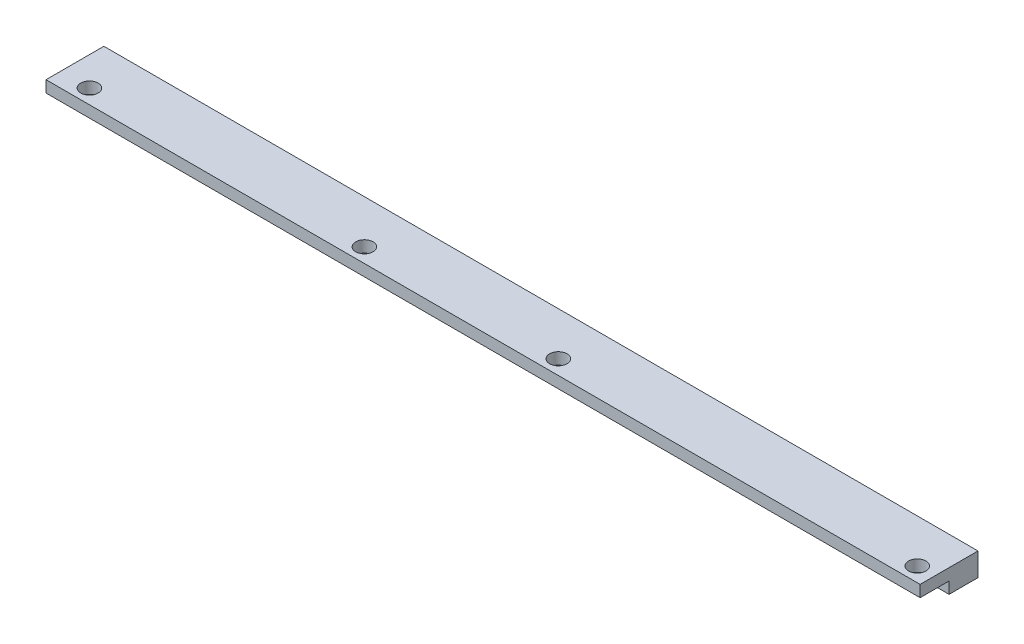
ISO-10303-21;
HEADER;
FILE_DESCRIPTION(('STEP AP214'),'2;1');
FILE_NAME('part.step','',(''),(''),'','','');
FILE_SCHEMA(('AUTOMOTIVE_DESIGN { 1 0 10303 214 1 1 1 1 }'));
ENDSEC;
DATA;
#1=APPLICATION_CONTEXT('core data for automotive mechanical design processes');
#2=APPLICATION_PROTOCOL_DEFINITION('international standard','automotive_design',2000,#1);
#3=PRODUCT_CONTEXT('',#1,'mechanical');
#4=PRODUCT('Part','Part','',(#3));
#5=PRODUCT_RELATED_PRODUCT_CATEGORY('part','',(#4));
#6=PRODUCT_DEFINITION_FORMATION('','',#4);
#7=PRODUCT_DEFINITION_CONTEXT('part definition',#1,'design');
#8=PRODUCT_DEFINITION('design','',#6,#7);
#9=PRODUCT_DEFINITION_SHAPE('','',#8);
#10=(LENGTH_UNIT() NAMED_UNIT(*) SI_UNIT(.MILLI.,.METRE.));
#11=(NAMED_UNIT(*) PLANE_ANGLE_UNIT() SI_UNIT($,.RADIAN.));
#12=(NAMED_UNIT(*) SI_UNIT($,.STERADIAN.) SOLID_ANGLE_UNIT());
#13=UNCERTAINTY_MEASURE_WITH_UNIT(LENGTH_MEASURE(1.E-05),#10,'distance_accuracy_value','');
#14=(GEOMETRIC_REPRESENTATION_CONTEXT(3) GLOBAL_UNCERTAINTY_ASSIGNED_CONTEXT((#13)) GLOBAL_UNIT_ASSIGNED_CONTEXT((#10,
#11,#12)) REPRESENTATION_CONTEXT('',''));
#15=CARTESIAN_POINT('',(0.,0.,0.));
#16=DIRECTION('',(0.,0.,1.));
#17=DIRECTION('',(1.,0.,0.));
#18=AXIS2_PLACEMENT_3D('',#15,#16,#17);
#19=CARTESIAN_POINT('',(0.,2.,0.));
#20=DIRECTION('',(0.,-1.,0.));
#21=DIRECTION('',(0.,0.,-1.));
#22=AXIS2_PLACEMENT_3D('',#19,#20,#21);
#23=PLANE('',#22);
#24=DIRECTION('',(0.,0.,-1.));
#25=VECTOR('',#24,1.);
#26=CARTESIAN_POINT('',(0.,2.,5.));
#27=LINE('',#26,#25);
#28=CARTESIAN_POINT('',(0.,2.,5.));
#29=VERTEX_POINT('',#28);
#30=CARTESIAN_POINT('',(0.,2.,-5.));
#31=VERTEX_POINT('',#30);
#32=EDGE_CURVE('E140',#29,#31,#27,.T.);
#33=ORIENTED_EDGE('',*,*,#32,.F.);
#34=DIRECTION('',(1.,0.,0.));
#35=VECTOR('',#34,1.);
#36=CARTESIAN_POINT('',(0.,2.,5.));
#37=LINE('',#36,#35);
#38=CARTESIAN_POINT('',(151.,2.,5.));
#39=VERTEX_POINT('',#38);
#40=EDGE_CURVE('E129',#29,#39,#37,.T.);
#41=ORIENTED_EDGE('',*,*,#40,.T.);
#42=DIRECTION('',(0.,0.,-1.));
#43=VECTOR('',#42,1.);
#44=CARTESIAN_POINT('',(151.,2.,5.));
#45=LINE('',#44,#43);
#46=CARTESIAN_POINT('',(151.,2.,-5.));
#47=VERTEX_POINT('',#46);
#48=EDGE_CURVE('E231',#39,#47,#45,.T.);
#49=ORIENTED_EDGE('',*,*,#48,.T.);
#50=DIRECTION('',(-1.,0.,0.));
#51=VECTOR('',#50,1.);
#52=CARTESIAN_POINT('',(0.,2.,-5.));
#53=LINE('',#52,#51);
#54=EDGE_CURVE('E202',#47,#31,#53,.T.);
#55=ORIENTED_EDGE('',*,*,#54,.T.);
#56=EDGE_LOOP('',(#33,#41,#49,#55));
#57=FACE_BOUND('',#56,.T.);
#58=CARTESIAN_POINT('',(5.,2.,2.5));
#59=DIRECTION('',(0.,1.,0.));
#60=DIRECTION('',(0.,0.,1.));
#61=AXIS2_PLACEMENT_3D('',#58,#59,#60);
#62=CIRCLE('',#61,1.5);
#63=CARTESIAN_POINT('',(5.,2.,4.));
#64=VERTEX_POINT('',#63);
#65=EDGE_CURVE('E147',#64,#64,#62,.T.);
#66=ORIENTED_EDGE('',*,*,#65,.F.);
#67=EDGE_LOOP('',(#66));
#68=FACE_BOUND('',#67,.T.);
#69=CARTESIAN_POINT('',(52.5,2.,2.49999999999999));
#70=DIRECTION('',(0.,1.,0.));
#71=DIRECTION('',(0.,0.,1.));
#72=AXIS2_PLACEMENT_3D('',#69,#70,#71);
#73=CIRCLE('',#72,1.5);
#74=CARTESIAN_POINT('',(52.5,2.,3.99999999999999));
#75=VERTEX_POINT('',#74);
#76=EDGE_CURVE('E224',#75,#75,#73,.T.);
#77=ORIENTED_EDGE('',*,*,#76,.F.);
#78=EDGE_LOOP('',(#77));
#79=FACE_BOUND('',#78,.T.);
#80=CARTESIAN_POINT('',(86.,2.,2.5));
#81=DIRECTION('',(0.,1.,0.));
#82=DIRECTION('',(0.,0.,1.));
#83=AXIS2_PLACEMENT_3D('',#80,#81,#82);
#84=CIRCLE('',#83,1.5);
#85=CARTESIAN_POINT('',(86.,2.,4.));
#86=VERTEX_POINT('',#85);
#87=EDGE_CURVE('E218',#86,#86,#84,.T.);
#88=ORIENTED_EDGE('',*,*,#87,.F.);
#89=EDGE_LOOP('',(#88));
#90=FACE_BOUND('',#89,.T.);
#91=CARTESIAN_POINT('',(148.,2.,2.50000000000002));
#92=DIRECTION('',(0.,1.,0.));
#93=DIRECTION('',(0.,0.,1.));
#94=AXIS2_PLACEMENT_3D('',#91,#92,#93);
#95=CIRCLE('',#94,1.5);
#96=CARTESIAN_POINT('',(148.,2.,4.00000000000001));
#97=VERTEX_POINT('',#96);
#98=EDGE_CURVE('E212',#97,#97,#95,.T.);
#99=ORIENTED_EDGE('',*,*,#98,.F.);
#100=EDGE_LOOP('',(#99));
#101=FACE_BOUND('',#100,.T.);
#102=ADVANCED_FACE('F97',(#57,#68,#79,#90,#101),#23,.F.);
#103=CARTESIAN_POINT('',(0.,0.,0.));
#104=DIRECTION('',(0.,-1.,0.));
#105=DIRECTION('',(0.,0.,-1.));
#106=AXIS2_PLACEMENT_3D('',#103,#104,#105);
#107=PLANE('',#106);
#108=CARTESIAN_POINT('',(86.,0.,2.5));
#109=DIRECTION('',(0.,1.,0.));
#110=DIRECTION('',(0.,0.,1.));
#111=AXIS2_PLACEMENT_3D('',#108,#109,#110);
#112=CIRCLE('',#111,1.5);
#113=CARTESIAN_POINT('',(86.,0.,4.));
#114=VERTEX_POINT('',#113);
#115=EDGE_CURVE('E215',#114,#114,#112,.T.);
#116=ORIENTED_EDGE('',*,*,#115,.T.);
#117=EDGE_LOOP('',(#116));
#118=FACE_BOUND('',#117,.T.);
#119=CARTESIAN_POINT('',(5.,0.,2.5));
#120=DIRECTION('',(0.,1.,0.));
#121=DIRECTION('',(0.,0.,1.));
#122=AXIS2_PLACEMENT_3D('',#119,#120,#121);
#123=CIRCLE('',#122,1.5);
#124=CARTESIAN_POINT('',(5.,0.,4.));
#125=VERTEX_POINT('',#124);
#126=EDGE_CURVE('E151',#125,#125,#123,.T.);
#127=ORIENTED_EDGE('',*,*,#126,.T.);
#128=EDGE_LOOP('',(#127));
#129=FACE_BOUND('',#128,.T.);
#130=DIRECTION('',(0.,0.,-1.));
#131=VECTOR('',#130,1.);
#132=CARTESIAN_POINT('',(0.,0.,5.));
#133=LINE('',#132,#131);
#134=CARTESIAN_POINT('',(0.,0.,5.));
#135=VERTEX_POINT('',#134);
#136=CARTESIAN_POINT('',(0.,0.,0.));
#137=VERTEX_POINT('',#136);
#138=EDGE_CURVE('E137',#135,#137,#133,.T.);
#139=ORIENTED_EDGE('',*,*,#138,.T.);
#140=DIRECTION('',(1.,0.,0.));
#141=VECTOR('',#140,1.);
#142=CARTESIAN_POINT('',(0.,0.,0.));
#143=LINE('',#142,#141);
#144=CARTESIAN_POINT('',(151.,0.,0.));
#145=VERTEX_POINT('',#144);
#146=EDGE_CURVE('E146',#137,#145,#143,.T.);
#147=ORIENTED_EDGE('',*,*,#146,.T.);
#148=DIRECTION('',(0.,0.,-1.));
#149=VECTOR('',#148,1.);
#150=CARTESIAN_POINT('',(151.,0.,5.));
#151=LINE('',#150,#149);
#152=CARTESIAN_POINT('',(151.,0.,5.));
#153=VERTEX_POINT('',#152);
#154=EDGE_CURVE('E139',#153,#145,#151,.T.);
#155=ORIENTED_EDGE('',*,*,#154,.F.);
#156=DIRECTION('',(1.,0.,0.));
#157=VECTOR('',#156,1.);
#158=CARTESIAN_POINT('',(0.,0.,5.));
#159=LINE('',#158,#157);
#160=EDGE_CURVE('E126',#135,#153,#159,.T.);
#161=ORIENTED_EDGE('',*,*,#160,.F.);
#162=EDGE_LOOP('',(#139,#147,#155,#161));
#163=FACE_BOUND('',#162,.T.);
#164=CARTESIAN_POINT('',(52.5,0.,2.49999999999999));
#165=DIRECTION('',(0.,1.,0.));
#166=DIRECTION('',(0.,0.,1.));
#167=AXIS2_PLACEMENT_3D('',#164,#165,#166);
#168=CIRCLE('',#167,1.5);
#169=CARTESIAN_POINT('',(52.5,0.,3.99999999999999));
#170=VERTEX_POINT('',#169);
#171=EDGE_CURVE('E221',#170,#170,#168,.T.);
#172=ORIENTED_EDGE('',*,*,#171,.T.);
#173=EDGE_LOOP('',(#172));
#174=FACE_BOUND('',#173,.T.);
#175=CARTESIAN_POINT('',(148.,0.,2.50000000000002));
#176=DIRECTION('',(0.,1.,0.));
#177=DIRECTION('',(0.,0.,1.));
#178=AXIS2_PLACEMENT_3D('',#175,#176,#177);
#179=CIRCLE('',#178,1.5);
#180=CARTESIAN_POINT('',(148.,0.,4.00000000000001));
#181=VERTEX_POINT('',#180);
#182=EDGE_CURVE('E209',#181,#181,#179,.T.);
#183=ORIENTED_EDGE('',*,*,#182,.T.);
#184=EDGE_LOOP('',(#183));
#185=FACE_BOUND('',#184,.T.);
#186=ADVANCED_FACE('F134',(#118,#129,#163,#174,#185),#107,.T.);
#187=CARTESIAN_POINT('',(0.,2.,5.));
#188=DIRECTION('',(-1.,0.,0.));
#189=DIRECTION('',(0.,0.,1.));
#190=AXIS2_PLACEMENT_3D('',#187,#188,#189);
#191=PLANE('',#190);
#192=ORIENTED_EDGE('',*,*,#138,.F.);
#193=DIRECTION('',(0.,-1.,0.));
#194=VECTOR('',#193,1.);
#195=CARTESIAN_POINT('',(0.,2.,5.));
#196=LINE('',#195,#194);
#197=EDGE_CURVE('E12',#29,#135,#196,.T.);
#198=ORIENTED_EDGE('',*,*,#197,.F.);
#199=ORIENTED_EDGE('',*,*,#32,.T.);
#200=DIRECTION('',(0.,1.,0.));
#201=VECTOR('',#200,1.);
#202=CARTESIAN_POINT('',(0.,-2.,-5.));
#203=LINE('',#202,#201);
#204=CARTESIAN_POINT('',(0.,-2.,-5.));
#205=VERTEX_POINT('',#204);
#206=EDGE_CURVE('E183',#205,#31,#203,.T.);
#207=ORIENTED_EDGE('',*,*,#206,.F.);
#208=DIRECTION('',(0.,0.,1.));
#209=VECTOR('',#208,1.);
#210=CARTESIAN_POINT('',(0.,-2.,0.));
#211=LINE('',#210,#209);
#212=CARTESIAN_POINT('',(0.,-2.,0.));
#213=VERTEX_POINT('',#212);
#214=EDGE_CURVE('E185',#205,#213,#211,.T.);
#215=ORIENTED_EDGE('',*,*,#214,.T.);
#216=DIRECTION('',(0.,1.,0.));
#217=VECTOR('',#216,1.);
#218=CARTESIAN_POINT('',(0.,-2.,0.));
#219=LINE('',#218,#217);
#220=EDGE_CURVE('E145',#213,#137,#219,.T.);
#221=ORIENTED_EDGE('',*,*,#220,.T.);
#222=EDGE_LOOP('',(#192,#198,#199,#207,#215,#221));
#223=FACE_BOUND('',#222,.T.);
#224=ADVANCED_FACE('F99',(#223),#191,.T.);
#225=CARTESIAN_POINT('',(0.,2.,5.));
#226=DIRECTION('',(0.,0.,-1.));
#227=DIRECTION('',(-1.,0.,0.));
#228=AXIS2_PLACEMENT_3D('',#225,#226,#227);
#229=PLANE('',#228);
#230=ORIENTED_EDGE('',*,*,#160,.T.);
#231=DIRECTION('',(0.,-1.,0.));
#232=VECTOR('',#231,1.);
#233=CARTESIAN_POINT('',(151.,2.,5.));
#234=LINE('',#233,#232);
#235=EDGE_CURVE('E101',#39,#153,#234,.T.);
#236=ORIENTED_EDGE('',*,*,#235,.F.);
#237=ORIENTED_EDGE('',*,*,#40,.F.);
#238=ORIENTED_EDGE('',*,*,#197,.T.);
#239=EDGE_LOOP('',(#230,#236,#237,#238));
#240=FACE_BOUND('',#239,.T.);
#241=ADVANCED_FACE('F128',(#240),#229,.F.);
#242=CARTESIAN_POINT('',(151.,2.,5.));
#243=DIRECTION('',(-1.,0.,0.));
#244=DIRECTION('',(0.,0.,1.));
#245=AXIS2_PLACEMENT_3D('',#242,#243,#244);
#246=PLANE('',#245);
#247=ORIENTED_EDGE('',*,*,#154,.T.);
#248=DIRECTION('',(0.,1.,0.));
#249=VECTOR('',#248,1.);
#250=CARTESIAN_POINT('',(151.,-2.,0.));
#251=LINE('',#250,#249);
#252=CARTESIAN_POINT('',(151.,-2.,0.));
#253=VERTEX_POINT('',#252);
#254=EDGE_CURVE('E161',#253,#145,#251,.T.);
#255=ORIENTED_EDGE('',*,*,#254,.F.);
#256=DIRECTION('',(0.,0.,-1.));
#257=VECTOR('',#256,1.);
#258=CARTESIAN_POINT('',(151.,-2.,0.));
#259=LINE('',#258,#257);
#260=CARTESIAN_POINT('',(151.,-2.,-5.));
#261=VERTEX_POINT('',#260);
#262=EDGE_CURVE('E190',#253,#261,#259,.T.);
#263=ORIENTED_EDGE('',*,*,#262,.T.);
#264=DIRECTION('',(0.,1.,0.));
#265=VECTOR('',#264,1.);
#266=CARTESIAN_POINT('',(151.,-2.,-5.));
#267=LINE('',#266,#265);
#268=EDGE_CURVE('E201',#261,#47,#267,.T.);
#269=ORIENTED_EDGE('',*,*,#268,.T.);
#270=ORIENTED_EDGE('',*,*,#48,.F.);
#271=ORIENTED_EDGE('',*,*,#235,.T.);
#272=EDGE_LOOP('',(#247,#255,#263,#269,#270,#271));
#273=FACE_BOUND('',#272,.T.);
#274=ADVANCED_FACE('F158',(#273),#246,.F.);
#275=CARTESIAN_POINT('',(5.,2.,2.5));
#276=DIRECTION('',(0.,-1.,0.));
#277=DIRECTION('',(0.,0.,-1.));
#278=AXIS2_PLACEMENT_3D('',#275,#276,#277);
#279=CYLINDRICAL_SURFACE('',#278,1.5);
#280=ORIENTED_EDGE('',*,*,#65,.T.);
#281=EDGE_LOOP('',(#280));
#282=FACE_BOUND('',#281,.T.);
#283=ORIENTED_EDGE('',*,*,#126,.F.);
#284=EDGE_LOOP('',(#283));
#285=FACE_BOUND('',#284,.T.);
#286=ADVANCED_FACE('F264',(#282,#285),#279,.F.);
#287=CARTESIAN_POINT('',(52.5,2.,2.49999999999999));
#288=DIRECTION('',(0.,-1.,0.));
#289=DIRECTION('',(0.,0.,-1.));
#290=AXIS2_PLACEMENT_3D('',#287,#288,#289);
#291=CYLINDRICAL_SURFACE('',#290,1.5);
#292=ORIENTED_EDGE('',*,*,#76,.T.);
#293=EDGE_LOOP('',(#292));
#294=FACE_BOUND('',#293,.T.);
#295=ORIENTED_EDGE('',*,*,#171,.F.);
#296=EDGE_LOOP('',(#295));
#297=FACE_BOUND('',#296,.T.);
#298=ADVANCED_FACE('F269',(#294,#297),#291,.F.);
#299=CARTESIAN_POINT('',(86.,2.,2.5));
#300=DIRECTION('',(0.,-1.,0.));
#301=DIRECTION('',(0.,0.,-1.));
#302=AXIS2_PLACEMENT_3D('',#299,#300,#301);
#303=CYLINDRICAL_SURFACE('',#302,1.5);
#304=ORIENTED_EDGE('',*,*,#87,.T.);
#305=EDGE_LOOP('',(#304));
#306=FACE_BOUND('',#305,.T.);
#307=ORIENTED_EDGE('',*,*,#115,.F.);
#308=EDGE_LOOP('',(#307));
#309=FACE_BOUND('',#308,.T.);
#310=ADVANCED_FACE('F247',(#306,#309),#303,.F.);
#311=CARTESIAN_POINT('',(148.,2.,2.50000000000002));
#312=DIRECTION('',(0.,-1.,0.));
#313=DIRECTION('',(0.,0.,-1.));
#314=AXIS2_PLACEMENT_3D('',#311,#312,#313);
#315=CYLINDRICAL_SURFACE('',#314,1.5);
#316=ORIENTED_EDGE('',*,*,#98,.T.);
#317=EDGE_LOOP('',(#316));
#318=FACE_BOUND('',#317,.T.);
#319=ORIENTED_EDGE('',*,*,#182,.F.);
#320=EDGE_LOOP('',(#319));
#321=FACE_BOUND('',#320,.T.);
#322=ADVANCED_FACE('F244',(#318,#321),#315,.F.);
#323=CARTESIAN_POINT('',(0.,-2.,0.));
#324=DIRECTION('',(0.,0.,1.));
#325=DIRECTION('',(1.,0.,0.));
#326=AXIS2_PLACEMENT_3D('',#323,#324,#325);
#327=PLANE('',#326);
#328=ORIENTED_EDGE('',*,*,#146,.F.);
#329=ORIENTED_EDGE('',*,*,#220,.F.);
#330=DIRECTION('',(1.,0.,0.));
#331=VECTOR('',#330,1.);
#332=CARTESIAN_POINT('',(0.,-2.,0.));
#333=LINE('',#332,#331);
#334=EDGE_CURVE('E197',#213,#253,#333,.T.);
#335=ORIENTED_EDGE('',*,*,#334,.T.);
#336=ORIENTED_EDGE('',*,*,#254,.T.);
#337=EDGE_LOOP('',(#328,#329,#335,#336));
#338=FACE_BOUND('',#337,.T.);
#339=ADVANCED_FACE('F166',(#338),#327,.T.);
#340=CARTESIAN_POINT('',(0.,-2.,-5.));
#341=DIRECTION('',(0.,0.,-1.));
#342=DIRECTION('',(-1.,0.,0.));
#343=AXIS2_PLACEMENT_3D('',#340,#341,#342);
#344=PLANE('',#343);
#345=ORIENTED_EDGE('',*,*,#54,.F.);
#346=ORIENTED_EDGE('',*,*,#268,.F.);
#347=DIRECTION('',(-1.,0.,0.));
#348=VECTOR('',#347,1.);
#349=CARTESIAN_POINT('',(0.,-2.,-5.));
#350=LINE('',#349,#348);
#351=EDGE_CURVE('E196',#261,#205,#350,.T.);
#352=ORIENTED_EDGE('',*,*,#351,.T.);
#353=ORIENTED_EDGE('',*,*,#206,.T.);
#354=EDGE_LOOP('',(#345,#346,#352,#353));
#355=FACE_BOUND('',#354,.T.);
#356=ADVANCED_FACE('F199',(#355),#344,.T.);
#357=CARTESIAN_POINT('',(0.,-2.,0.));
#358=DIRECTION('',(0.,1.,0.));
#359=DIRECTION('',(0.,0.,1.));
#360=AXIS2_PLACEMENT_3D('',#357,#358,#359);
#361=PLANE('',#360);
#362=ORIENTED_EDGE('',*,*,#351,.F.);
#363=ORIENTED_EDGE('',*,*,#262,.F.);
#364=ORIENTED_EDGE('',*,*,#334,.F.);
#365=ORIENTED_EDGE('',*,*,#214,.F.);
#366=EDGE_LOOP('',(#362,#363,#364,#365));
#367=FACE_BOUND('',#366,.T.);
#368=ADVANCED_FACE('F194',(#367),#361,.F.);
#369=CLOSED_SHELL('',(#102,#186,#224,#241,#274,#286,#298,#310,#322,#339,#356,#368));
#370=MANIFOLD_SOLID_BREP('B2',#369);
#371=ADVANCED_BREP_SHAPE_REPRESENTATION('',(#18,#370),#14);
#372=SHAPE_DEFINITION_REPRESENTATION(#9,#371);
ENDSEC;
END-ISO-10303-21;
